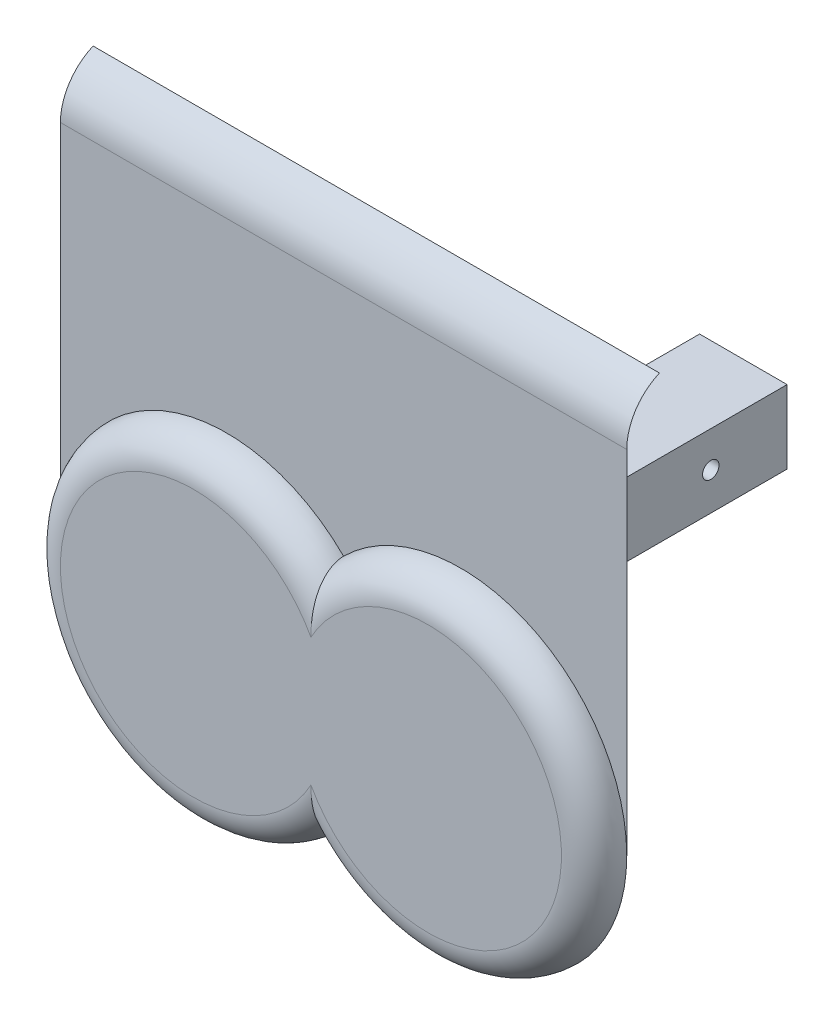
ISO-10303-21;
HEADER;
FILE_DESCRIPTION(('STEP AP214'),'2;1');
FILE_NAME('part.step','',(''),(''),'','','');
FILE_SCHEMA(('AUTOMOTIVE_DESIGN { 1 0 10303 214 1 1 1 1 }'));
ENDSEC;
DATA;
#1=APPLICATION_CONTEXT('core data for automotive mechanical design processes');
#2=APPLICATION_PROTOCOL_DEFINITION('international standard','automotive_design',2000,#1);
#3=PRODUCT_CONTEXT('',#1,'mechanical');
#4=PRODUCT('Part','Part','',(#3));
#5=PRODUCT_RELATED_PRODUCT_CATEGORY('part','',(#4));
#6=PRODUCT_DEFINITION_FORMATION('','',#4);
#7=PRODUCT_DEFINITION_CONTEXT('part definition',#1,'design');
#8=PRODUCT_DEFINITION('design','',#6,#7);
#9=PRODUCT_DEFINITION_SHAPE('','',#8);
#10=(LENGTH_UNIT() NAMED_UNIT(*) SI_UNIT(.MILLI.,.METRE.));
#11=(NAMED_UNIT(*) PLANE_ANGLE_UNIT() SI_UNIT($,.RADIAN.));
#12=(NAMED_UNIT(*) SI_UNIT($,.STERADIAN.) SOLID_ANGLE_UNIT());
#13=UNCERTAINTY_MEASURE_WITH_UNIT(LENGTH_MEASURE(1.E-05),#10,'distance_accuracy_value','');
#14=(GEOMETRIC_REPRESENTATION_CONTEXT(3) GLOBAL_UNCERTAINTY_ASSIGNED_CONTEXT((#13)) GLOBAL_UNIT_ASSIGNED_CONTEXT((#10,
#11,#12)) REPRESENTATION_CONTEXT('',''));
#15=CARTESIAN_POINT('',(0.,0.,0.));
#16=DIRECTION('',(0.,0.,1.));
#17=DIRECTION('',(1.,0.,0.));
#18=AXIS2_PLACEMENT_3D('',#15,#16,#17);
#19=CARTESIAN_POINT('',(25.7316100980738,12.2927245380799,-12.));
#20=DIRECTION('',(1.,0.,0.));
#21=DIRECTION('',(0.,0.,-1.));
#22=AXIS2_PLACEMENT_3D('',#19,#20,#21);
#23=PLANE('',#22);
#24=CARTESIAN_POINT('',(25.7316100980738,15.7320274793413,-4.98829969518511));
#25=DIRECTION('',(-1.,0.,0.));
#26=DIRECTION('',(0.,0.,1.));
#27=AXIS2_PLACEMENT_3D('',#24,#25,#26);
#28=CIRCLE('',#27,0.75565);
#29=CARTESIAN_POINT('',(25.7316100980738,15.7320274793413,-4.23264969518511));
#30=VERTEX_POINT('',#29);
#31=EDGE_CURVE('E122',#30,#30,#28,.T.);
#32=ORIENTED_EDGE('',*,*,#31,.T.);
#33=EDGE_LOOP('',(#32));
#34=FACE_BOUND('',#33,.T.);
#35=DIRECTION('',(0.,1.,0.));
#36=VECTOR('',#35,1.);
#37=CARTESIAN_POINT('',(25.7316100980738,12.2927245380799,3.));
#38=LINE('',#37,#36);
#39=CARTESIAN_POINT('',(25.7316100980738,12.2927245380799,3.));
#40=VERTEX_POINT('',#39);
#41=CARTESIAN_POINT('',(25.7316100980738,19.0162302948823,3.));
#42=VERTEX_POINT('',#41);
#43=EDGE_CURVE('E118',#40,#42,#38,.T.);
#44=ORIENTED_EDGE('',*,*,#43,.F.);
#45=DIRECTION('',(0.,0.,1.));
#46=VECTOR('',#45,1.);
#47=CARTESIAN_POINT('',(25.7316100980738,12.2927245380799,-12.));
#48=LINE('',#47,#46);
#49=CARTESIAN_POINT('',(25.7316100980738,12.2927245380799,-12.));
#50=VERTEX_POINT('',#49);
#51=EDGE_CURVE('E12',#50,#40,#48,.T.);
#52=ORIENTED_EDGE('',*,*,#51,.F.);
#53=DIRECTION('',(0.,1.,0.));
#54=VECTOR('',#53,1.);
#55=CARTESIAN_POINT('',(25.7316100980738,12.2927245380799,-12.));
#56=LINE('',#55,#54);
#57=CARTESIAN_POINT('',(25.7316100980738,19.0162302948823,-12.));
#58=VERTEX_POINT('',#57);
#59=EDGE_CURVE('E111',#50,#58,#56,.T.);
#60=ORIENTED_EDGE('',*,*,#59,.T.);
#61=DIRECTION('',(0.,0.,1.));
#62=VECTOR('',#61,1.);
#63=CARTESIAN_POINT('',(25.7316100980738,19.0162302948823,-12.));
#64=LINE('',#63,#62);
#65=EDGE_CURVE('E56',#58,#42,#64,.T.);
#66=ORIENTED_EDGE('',*,*,#65,.T.);
#67=EDGE_LOOP('',(#44,#52,#60,#66));
#68=FACE_BOUND('',#67,.T.);
#69=ADVANCED_FACE('F53',(#34,#68),#23,.T.);
#70=CARTESIAN_POINT('',(25.7316100980738,12.2927245380799,-12.));
#71=DIRECTION('',(0.,-1.,0.));
#72=DIRECTION('',(0.,0.,-1.));
#73=AXIS2_PLACEMENT_3D('',#70,#71,#72);
#74=PLANE('',#73);
#75=DIRECTION('',(1.,0.,0.));
#76=VECTOR('',#75,1.);
#77=CARTESIAN_POINT('',(25.7316100980738,12.2927245380799,3.));
#78=LINE('',#77,#76);
#79=CARTESIAN_POINT('',(17.692635823636,12.2927245380799,3.));
#80=VERTEX_POINT('',#79);
#81=EDGE_CURVE('E113',#80,#40,#78,.T.);
#82=ORIENTED_EDGE('',*,*,#81,.F.);
#83=DIRECTION('',(0.,0.,1.));
#84=VECTOR('',#83,1.);
#85=CARTESIAN_POINT('',(17.692635823636,12.2927245380799,-12.));
#86=LINE('',#85,#84);
#87=CARTESIAN_POINT('',(17.692635823636,12.2927245380799,-12.));
#88=VERTEX_POINT('',#87);
#89=EDGE_CURVE('E62',#88,#80,#86,.T.);
#90=ORIENTED_EDGE('',*,*,#89,.F.);
#91=DIRECTION('',(1.,0.,0.));
#92=VECTOR('',#91,1.);
#93=CARTESIAN_POINT('',(25.7316100980738,12.2927245380799,-12.));
#94=LINE('',#93,#92);
#95=EDGE_CURVE('E108',#88,#50,#94,.T.);
#96=ORIENTED_EDGE('',*,*,#95,.T.);
#97=ORIENTED_EDGE('',*,*,#51,.T.);
#98=EDGE_LOOP('',(#82,#90,#96,#97));
#99=FACE_BOUND('',#98,.T.);
#100=ADVANCED_FACE('F129',(#99),#74,.T.);
#101=CARTESIAN_POINT('',(17.692635823636,12.2927245380799,-12.));
#102=DIRECTION('',(-1.,0.,0.));
#103=DIRECTION('',(0.,0.,1.));
#104=AXIS2_PLACEMENT_3D('',#101,#102,#103);
#105=PLANE('',#104);
#106=CARTESIAN_POINT('',(17.692635823636,15.7320274793413,-4.98829969518511));
#107=DIRECTION('',(-1.,0.,0.));
#108=DIRECTION('',(0.,0.,1.));
#109=AXIS2_PLACEMENT_3D('',#106,#107,#108);
#110=CIRCLE('',#109,1.63195);
#111=CARTESIAN_POINT('',(17.692635823636,15.7320274793413,-3.35634969518511));
#112=VERTEX_POINT('',#111);
#113=EDGE_CURVE('E164',#112,#112,#110,.T.);
#114=ORIENTED_EDGE('',*,*,#113,.F.);
#115=EDGE_LOOP('',(#114));
#116=FACE_BOUND('',#115,.T.);
#117=DIRECTION('',(0.,-1.,0.));
#118=VECTOR('',#117,1.);
#119=CARTESIAN_POINT('',(17.692635823636,12.2927245380799,3.));
#120=LINE('',#119,#118);
#121=CARTESIAN_POINT('',(17.692635823636,19.0162302948823,3.));
#122=VERTEX_POINT('',#121);
#123=EDGE_CURVE('E103',#122,#80,#120,.T.);
#124=ORIENTED_EDGE('',*,*,#123,.F.);
#125=DIRECTION('',(0.,0.,1.));
#126=VECTOR('',#125,1.);
#127=CARTESIAN_POINT('',(17.692635823636,19.0162302948823,-12.));
#128=LINE('',#127,#126);
#129=CARTESIAN_POINT('',(17.692635823636,19.0162302948823,-12.));
#130=VERTEX_POINT('',#129);
#131=EDGE_CURVE('E98',#130,#122,#128,.T.);
#132=ORIENTED_EDGE('',*,*,#131,.F.);
#133=DIRECTION('',(0.,-1.,0.));
#134=VECTOR('',#133,1.);
#135=CARTESIAN_POINT('',(17.692635823636,12.2927245380799,-12.));
#136=LINE('',#135,#134);
#137=EDGE_CURVE('E101',#130,#88,#136,.T.);
#138=ORIENTED_EDGE('',*,*,#137,.T.);
#139=ORIENTED_EDGE('',*,*,#89,.T.);
#140=EDGE_LOOP('',(#124,#132,#138,#139));
#141=FACE_BOUND('',#140,.T.);
#142=ADVANCED_FACE('F100',(#116,#141),#105,.T.);
#143=CARTESIAN_POINT('',(25.7316100980738,19.0162302948823,-12.));
#144=DIRECTION('',(0.,1.,0.));
#145=DIRECTION('',(0.,0.,1.));
#146=AXIS2_PLACEMENT_3D('',#143,#144,#145);
#147=PLANE('',#146);
#148=DIRECTION('',(-1.,0.,0.));
#149=VECTOR('',#148,1.);
#150=CARTESIAN_POINT('',(25.7316100980738,19.0162302948823,3.));
#151=LINE('',#150,#149);
#152=EDGE_CURVE('E121',#42,#122,#151,.T.);
#153=ORIENTED_EDGE('',*,*,#152,.F.);
#154=ORIENTED_EDGE('',*,*,#65,.F.);
#155=DIRECTION('',(-1.,0.,0.));
#156=VECTOR('',#155,1.);
#157=CARTESIAN_POINT('',(25.7316100980738,19.0162302948823,-12.));
#158=LINE('',#157,#156);
#159=EDGE_CURVE('E107',#58,#130,#158,.T.);
#160=ORIENTED_EDGE('',*,*,#159,.T.);
#161=ORIENTED_EDGE('',*,*,#131,.T.);
#162=EDGE_LOOP('',(#153,#154,#160,#161));
#163=FACE_BOUND('',#162,.T.);
#164=ADVANCED_FACE('F110',(#163),#147,.T.);
#165=CARTESIAN_POINT('',(0.,0.,-12.));
#166=DIRECTION('',(0.,0.,1.));
#167=DIRECTION('',(1.,0.,0.));
#168=AXIS2_PLACEMENT_3D('',#165,#166,#167);
#169=PLANE('',#168);
#170=ORIENTED_EDGE('',*,*,#59,.F.);
#171=ORIENTED_EDGE('',*,*,#95,.F.);
#172=ORIENTED_EDGE('',*,*,#137,.F.);
#173=ORIENTED_EDGE('',*,*,#159,.F.);
#174=EDGE_LOOP('',(#170,#171,#172,#173));
#175=FACE_BOUND('',#174,.T.);
#176=ADVANCED_FACE('F106',(#175),#169,.F.);
#177=CARTESIAN_POINT('',(0.,0.,3.));
#178=DIRECTION('',(0.,0.,1.));
#179=DIRECTION('',(1.,0.,0.));
#180=AXIS2_PLACEMENT_3D('',#177,#178,#179);
#181=PLANE('',#180);
#182=ORIENTED_EDGE('',*,*,#43,.T.);
#183=ORIENTED_EDGE('',*,*,#152,.T.);
#184=ORIENTED_EDGE('',*,*,#123,.T.);
#185=ORIENTED_EDGE('',*,*,#81,.T.);
#186=EDGE_LOOP('',(#182,#183,#184,#185));
#187=FACE_BOUND('',#186,.T.);
#188=ADVANCED_FACE('F128',(#187),#181,.T.);
#189=CARTESIAN_POINT('',(17.692635823636,15.7320274793413,-4.98829969518511));
#190=DIRECTION('',(-1.,0.,0.));
#191=DIRECTION('',(0.,0.,1.));
#192=AXIS2_PLACEMENT_3D('',#189,#190,#191);
#193=CYLINDRICAL_SURFACE('',#192,0.75565);
#194=ORIENTED_EDGE('',*,*,#31,.F.);
#195=EDGE_LOOP('',(#194));
#196=FACE_BOUND('',#195,.T.);
#197=CARTESIAN_POINT('',(18.568935823636,15.7320274793413,-4.98829969518511));
#198=DIRECTION('',(-1.,0.,0.));
#199=DIRECTION('',(0.,0.,1.));
#200=AXIS2_PLACEMENT_3D('',#197,#198,#199);
#201=CIRCLE('',#200,0.75565);
#202=CARTESIAN_POINT('',(18.568935823636,15.7320274793413,-4.23264969518511));
#203=VERTEX_POINT('',#202);
#204=EDGE_CURVE('E161',#203,#203,#201,.T.);
#205=ORIENTED_EDGE('',*,*,#204,.T.);
#206=EDGE_LOOP('',(#205));
#207=FACE_BOUND('',#206,.T.);
#208=ADVANCED_FACE('F148',(#196,#207),#193,.F.);
#209=CARTESIAN_POINT('',(17.692635823636,15.7320274793413,-4.98829969518511));
#210=DIRECTION('',(-1.,0.,0.));
#211=DIRECTION('',(0.,0.,1.));
#212=AXIS2_PLACEMENT_3D('',#209,#210,#211);
#213=CONICAL_SURFACE('',#212,1.63195,0.785398163397448);
#214=ORIENTED_EDGE('',*,*,#204,.F.);
#215=EDGE_LOOP('',(#214));
#216=FACE_BOUND('',#215,.T.);
#217=ORIENTED_EDGE('',*,*,#113,.T.);
#218=EDGE_LOOP('',(#217));
#219=FACE_BOUND('',#218,.T.);
#220=ADVANCED_FACE('F152',(#216,#219),#213,.F.);
#221=CLOSED_SHELL('',(#69,#100,#142,#164,#176,#188,#208,#220));
#222=MANIFOLD_SOLID_BREP('B2',#221);
#223=CARTESIAN_POINT('',(0.,0.,3.));
#224=DIRECTION('',(0.,0.,-1.));
#225=DIRECTION('',(-1.,0.,0.));
#226=AXIS2_PLACEMENT_3D('',#223,#224,#225);
#227=PLANE('',#226);
#228=CARTESIAN_POINT('',(10.7519968942127,-10.8202864458883,3.));
#229=DIRECTION('',(0.,0.,1.));
#230=DIRECTION('',(1.,0.,0.));
#231=AXIS2_PLACEMENT_3D('',#228,#229,#230);
#232=CIRCLE('',#231,15.253984265897);
#233=CARTESIAN_POINT('',(26.0059811601098,-10.8202864458883,3.));
#234=VERTEX_POINT('',#233);
#235=CARTESIAN_POINT('',(0.,0.,3.));
#236=VERTEX_POINT('',#235);
#237=EDGE_CURVE('E281',#234,#236,#232,.T.);
#238=ORIENTED_EDGE('',*,*,#237,.F.);
#239=DIRECTION('',(0.,1.,0.));
#240=VECTOR('',#239,1.);
#241=CARTESIAN_POINT('',(26.0059811601098,-26.0742707117853,3.));
#242=LINE('',#241,#240);
#243=CARTESIAN_POINT('',(26.0059811601098,21.4916950168295,3.));
#244=VERTEX_POINT('',#243);
#245=EDGE_CURVE('E287',#234,#244,#242,.T.);
#246=ORIENTED_EDGE('',*,*,#245,.T.);
#247=DIRECTION('',(1.,0.,0.));
#248=VECTOR('',#247,1.);
#249=CARTESIAN_POINT('',(0.,21.4916950168295,3.));
#250=LINE('',#249,#248);
#251=CARTESIAN_POINT('',(-26.0059811601098,21.4916950168295,3.));
#252=VERTEX_POINT('',#251);
#253=EDGE_CURVE('E305',#244,#252,#250,.F.);
#254=ORIENTED_EDGE('',*,*,#253,.T.);
#255=DIRECTION('',(0.,-1.,0.));
#256=VECTOR('',#255,1.);
#257=CARTESIAN_POINT('',(-26.0059811601098,-26.0742707117853,3.));
#258=LINE('',#257,#256);
#259=CARTESIAN_POINT('',(-26.0059811601098,-10.8202864458883,3.));
#260=VERTEX_POINT('',#259);
#261=EDGE_CURVE('E292',#252,#260,#258,.T.);
#262=ORIENTED_EDGE('',*,*,#261,.T.);
#263=CARTESIAN_POINT('',(-10.7519968942127,-10.8202864458883,3.));
#264=DIRECTION('',(0.,0.,-1.));
#265=DIRECTION('',(-1.,0.,0.));
#266=AXIS2_PLACEMENT_3D('',#263,#264,#265);
#267=CIRCLE('',#266,15.253984265897);
#268=EDGE_CURVE('E297',#236,#260,#267,.F.);
#269=ORIENTED_EDGE('',*,*,#268,.F.);
#270=EDGE_LOOP('',(#238,#246,#254,#262,#269));
#271=FACE_BOUND('',#270,.T.);
#272=ADVANCED_FACE('F220',(#271),#227,.F.);
#273=CARTESIAN_POINT('',(-26.0059811601098,21.4916950168295,-2.));
#274=DIRECTION('',(1.,0.,0.));
#275=DIRECTION('',(0.,0.,-1.));
#276=AXIS2_PLACEMENT_3D('',#273,#274,#275);
#277=CYLINDRICAL_SURFACE('',#276,5.);
#278=CARTESIAN_POINT('',(26.0059811601098,21.4916950168295,-2.));
#279=DIRECTION('',(-1.,0.,0.));
#280=DIRECTION('',(0.,0.,1.));
#281=AXIS2_PLACEMENT_3D('',#278,#279,#280);
#282=CIRCLE('',#281,5.);
#283=CARTESIAN_POINT('',(26.0059811601098,26.0742707117853,0.));
#284=VERTEX_POINT('',#283);
#285=EDGE_CURVE('E313',#284,#244,#282,.F.);
#286=ORIENTED_EDGE('',*,*,#285,.F.);
#287=DIRECTION('',(-1.,0.,0.));
#288=VECTOR('',#287,1.);
#289=CARTESIAN_POINT('',(-26.0059811601098,26.0742707117853,0.));
#290=LINE('',#289,#288);
#291=CARTESIAN_POINT('',(-26.0059811601098,26.0742707117853,0.));
#292=VERTEX_POINT('',#291);
#293=EDGE_CURVE('E293',#284,#292,#290,.T.);
#294=ORIENTED_EDGE('',*,*,#293,.T.);
#295=CARTESIAN_POINT('',(-26.0059811601098,21.4916950168295,-2.));
#296=DIRECTION('',(1.,0.,0.));
#297=DIRECTION('',(0.,0.,-1.));
#298=AXIS2_PLACEMENT_3D('',#295,#296,#297);
#299=CIRCLE('',#298,5.);
#300=EDGE_CURVE('E310',#252,#292,#299,.F.);
#301=ORIENTED_EDGE('',*,*,#300,.F.);
#302=ORIENTED_EDGE('',*,*,#253,.F.);
#303=EDGE_LOOP('',(#286,#294,#301,#302));
#304=FACE_BOUND('',#303,.T.);
#305=ADVANCED_FACE('F327',(#304),#277,.T.);
#306=CARTESIAN_POINT('',(-10.7519968942127,-10.8202864458883,6.));
#307=DIRECTION('',(0.,0.,1.));
#308=DIRECTION('',(1.,0.,0.));
#309=AXIS2_PLACEMENT_3D('',#306,#307,#308);
#310=PLANE('',#309);
#311=CARTESIAN_POINT('',(10.7519968942127,-10.8202864458883,6.));
#312=DIRECTION('',(0.,0.,1.));
#313=DIRECTION('',(1.,0.,0.));
#314=AXIS2_PLACEMENT_3D('',#311,#312,#313);
#315=CIRCLE('',#314,12.253984265897);
#316=CARTESIAN_POINT('',(0.,-16.6986104566665,6.));
#317=VERTEX_POINT('',#316);
#318=CARTESIAN_POINT('',(0.,-4.94196243511008,6.));
#319=VERTEX_POINT('',#318);
#320=EDGE_CURVE('E232',#317,#319,#315,.T.);
#321=ORIENTED_EDGE('',*,*,#320,.T.);
#322=CARTESIAN_POINT('',(-10.7519968942127,-10.8202864458883,6.));
#323=DIRECTION('',(0.,0.,1.));
#324=DIRECTION('',(1.,0.,0.));
#325=AXIS2_PLACEMENT_3D('',#322,#323,#324);
#326=CIRCLE('',#325,12.253984265897);
#327=EDGE_CURVE('E51',#319,#317,#326,.T.);
#328=ORIENTED_EDGE('',*,*,#327,.T.);
#329=EDGE_LOOP('',(#321,#328));
#330=FACE_BOUND('',#329,.T.);
#331=ADVANCED_FACE('F326',(#330),#310,.T.);
#332=CARTESIAN_POINT('',(10.7519968942127,-10.8202864458883,3.));
#333=DIRECTION('',(0.,0.,1.));
#334=DIRECTION('',(1.,0.,0.));
#335=AXIS2_PLACEMENT_3D('',#332,#333,#334);
#336=TOROIDAL_SURFACE('',#335,12.253984265897,3.);
#337=CARTESIAN_POINT('',(10.7519968942127,-26.0742707117853,3.));
#338=VERTEX_POINT('',#337);
#339=EDGE_CURVE('E277',#338,#234,#232,.T.);
#340=ORIENTED_EDGE('',*,*,#339,.T.);
#341=ORIENTED_EDGE('',*,*,#237,.T.);
#342=CARTESIAN_POINT('',(0.,0.,3.));
#343=CARTESIAN_POINT('',(0.,1.95007124230978E-05,3.06620735825665));
#344=CARTESIAN_POINT('',(0.,-0.00308914103174876,3.13240448509653));
#345=CARTESIAN_POINT('',(0.,-0.0154129297342623,3.26418834229766));
#346=CARTESIAN_POINT('',(0.,-0.0246243300564617,3.32977542214596));
#347=CARTESIAN_POINT('',(0.,-0.0489150876336411,3.45935647856996));
#348=CARTESIAN_POINT('',(0.,-0.0639510595788129,3.52335859583567));
#349=CARTESIAN_POINT('',(0.,-0.0996126550086658,3.6497722822654));
#350=CARTESIAN_POINT('',(0.,-0.120238854391052,3.71218368683121));
#351=CARTESIAN_POINT('',(0.,-0.189925072554892,3.89611380867449));
#352=CARTESIAN_POINT('',(0.,-0.246870340615428,4.01472802776266));
#353=CARTESIAN_POINT('',(0.,-0.378590412950921,4.24164431273649));
#354=CARTESIAN_POINT('',(0.,-0.453397738438844,4.34992705900544));
#355=CARTESIAN_POINT('',(0.,-0.646457060848609,4.59108534031693));
#356=CARTESIAN_POINT('',(0.,-0.770723813663914,4.71915163237239));
#357=CARTESIAN_POINT('',(0.,-1.03821549691492,4.95349557967945));
#358=CARTESIAN_POINT('',(0.,-1.1814718480384,5.05973636242014));
#359=CARTESIAN_POINT('',(0.,-1.54794279573178,5.29442328762124));
#360=CARTESIAN_POINT('',(0.,-1.7783367869301,5.4116612752752));
#361=CARTESIAN_POINT('',(0.,-2.13501488137236,5.55956644266099));
#362=CARTESIAN_POINT('',(0.,-2.25592963318741,5.60425171601462));
#363=CARTESIAN_POINT('',(0.,-2.50057040122472,5.68514582861091));
#364=CARTESIAN_POINT('',(0.,-2.62429584170236,5.72135638695055));
#365=CARTESIAN_POINT('',(0.,-2.926553499039,5.79980206606993));
#366=CARTESIAN_POINT('',(0.,-3.10610361148385,5.83809299124814));
#367=CARTESIAN_POINT('',(0.,-3.46753275263463,5.90129757462734));
#368=CARTESIAN_POINT('',(0.,-3.64941278674765,5.92620524394804));
#369=CARTESIAN_POINT('',(0.,-4.1964853468487,5.9838675710475));
#370=CARTESIAN_POINT('',(0.,-4.56352844716225,5.99965888699919));
#371=CARTESIAN_POINT('',(0.,-4.93400291728388,5.99999816902383));
#372=CARTESIAN_POINT('',(0.,-4.93798271046903,5.99999999120789));
#373=CARTESIAN_POINT('',(0.,-4.94196243511008,6.));
#374=B_SPLINE_CURVE_WITH_KNOTS('',3,(#342,#343,#344,#345,#346,#347,#348,#349,#350,#351,#352,
#353,#354,#355,#356,#357,#358,#359,#360,#361,#362,#363,#364,#365,#366,#367,#368,#369,#370,#371,
#372,#373),.UNSPECIFIED.,.F.,.F.,(4,2,2,2,2,2,2,2,2,2,2,2,2,2,2,4),(0.,0.198532368615019,
0.396942966046739,0.593903237432136,0.790883807117218,1.18364017627619,1.57711715889877,
2.10947248890786,2.64271992713783,3.41363951865964,3.80016544805583,4.18661290253029,
4.73673892687725,5.28711092282157,6.38657665083775,6.39851602778433),.UNSPECIFIED.);
#375=EDGE_CURVE('E224',#319,#236,#374,.F.);
#376=ORIENTED_EDGE('',*,*,#375,.F.);
#377=ORIENTED_EDGE('',*,*,#320,.F.);
#378=CARTESIAN_POINT('',(0.,-21.6405728917765,3.));
#379=CARTESIAN_POINT('',(0.,-21.640592392489,3.06620735825665));
#380=CARTESIAN_POINT('',(0.,-21.6374837507448,3.13240448509653));
#381=CARTESIAN_POINT('',(0.,-21.6251599620423,3.26418834229766));
#382=CARTESIAN_POINT('',(0.,-21.6159485617201,3.32977542214596));
#383=CARTESIAN_POINT('',(0.,-21.5916578041429,3.45935647856996));
#384=CARTESIAN_POINT('',(0.,-21.5766218321977,3.52335859583566));
#385=CARTESIAN_POINT('',(0.,-21.5409602367679,3.64977228226539));
#386=CARTESIAN_POINT('',(0.,-21.5203340373855,3.71218368683121));
#387=CARTESIAN_POINT('',(0.,-21.4506478192216,3.89611380867449));
#388=CARTESIAN_POINT('',(0.,-21.3937025511611,4.01472802776266));
#389=CARTESIAN_POINT('',(0.,-21.2619824788256,4.24164431273649));
#390=CARTESIAN_POINT('',(0.,-21.1871751533377,4.34992705900544));
#391=CARTESIAN_POINT('',(0.,-20.9941158309279,4.59108534031693));
#392=CARTESIAN_POINT('',(0.,-20.8698490781126,4.71915163237239));
#393=CARTESIAN_POINT('',(0.,-20.6023573948616,4.95349557967945));
#394=CARTESIAN_POINT('',(0.,-20.4591010437381,5.05973636242014));
#395=CARTESIAN_POINT('',(0.,-20.0926300960448,5.29442328762124));
#396=CARTESIAN_POINT('',(0.,-19.8622361048464,5.4116612752752));
#397=CARTESIAN_POINT('',(0.,-19.5055580104042,5.55956644266099));
#398=CARTESIAN_POINT('',(0.,-19.3846432585891,5.60425171601462));
#399=CARTESIAN_POINT('',(0.,-19.1400024905518,5.68514582861091));
#400=CARTESIAN_POINT('',(0.,-19.0162770500742,5.72135638695055));
#401=CARTESIAN_POINT('',(0.,-18.7140193927375,5.79980206606994));
#402=CARTESIAN_POINT('',(0.,-18.5344692802927,5.83809299124814));
#403=CARTESIAN_POINT('',(0.,-18.1730401391419,5.90129757462734));
#404=CARTESIAN_POINT('',(0.,-17.9911601050289,5.92620524394804));
#405=CARTESIAN_POINT('',(0.,-17.4440875449278,5.9838675710475));
#406=CARTESIAN_POINT('',(0.,-17.0770444446143,5.99965888699919));
#407=CARTESIAN_POINT('',(0.,-16.7065699744927,5.99999816902383));
#408=CARTESIAN_POINT('',(0.,-16.7025901813075,5.99999999120789));
#409=CARTESIAN_POINT('',(0.,-16.6986104566665,6.));
#410=B_SPLINE_CURVE_WITH_KNOTS('',3,(#378,#379,#380,#381,#382,#383,#384,#385,#386,#387,#388,
#389,#390,#391,#392,#393,#394,#395,#396,#397,#398,#399,#400,#401,#402,#403,#404,#405,#406,#407,
#408,#409),.UNSPECIFIED.,.F.,.F.,(4,2,2,2,2,2,2,2,2,2,2,2,2,2,2,4),(0.,0.198532368615019,
0.396942966046738,0.593903237432135,0.790883807117218,1.18364017627619,1.57711715889877,
2.10947248890786,2.64271992713783,3.41363951865964,3.80016544805583,4.18661290253029,
4.73673892687725,5.28711092282156,6.38657665083775,6.39851602778433),.UNSPECIFIED.);
#411=CARTESIAN_POINT('',(0.,-21.6405728917765,3.));
#412=VERTEX_POINT('',#411);
#413=EDGE_CURVE('E245',#412,#317,#410,.T.);
#414=ORIENTED_EDGE('',*,*,#413,.F.);
#415=EDGE_CURVE('E284',#412,#338,#232,.T.);
#416=ORIENTED_EDGE('',*,*,#415,.T.);
#417=EDGE_LOOP('',(#340,#341,#376,#377,#414,#416));
#418=FACE_BOUND('',#417,.T.);
#419=ADVANCED_FACE('F279',(#418),#336,.T.);
#420=CARTESIAN_POINT('',(-10.7519968942127,-10.8202864458883,3.));
#421=DIRECTION('',(0.,0.,1.));
#422=DIRECTION('',(1.,0.,0.));
#423=AXIS2_PLACEMENT_3D('',#420,#421,#422);
#424=TOROIDAL_SURFACE('',#423,12.253984265897,3.);
#425=CARTESIAN_POINT('',(-10.7519968942127,-10.8202864458883,3.));
#426=DIRECTION('',(0.,0.,1.));
#427=DIRECTION('',(1.,0.,0.));
#428=AXIS2_PLACEMENT_3D('',#425,#426,#427);
#429=CIRCLE('',#428,15.253984265897);
#430=CARTESIAN_POINT('',(-10.7519968942127,-26.0742707117853,3.));
#431=VERTEX_POINT('',#430);
#432=EDGE_CURVE('E298',#260,#431,#429,.T.);
#433=ORIENTED_EDGE('',*,*,#432,.T.);
#434=EDGE_CURVE('E316',#431,#412,#267,.F.);
#435=ORIENTED_EDGE('',*,*,#434,.T.);
#436=ORIENTED_EDGE('',*,*,#413,.T.);
#437=ORIENTED_EDGE('',*,*,#327,.F.);
#438=ORIENTED_EDGE('',*,*,#375,.T.);
#439=ORIENTED_EDGE('',*,*,#268,.T.);
#440=EDGE_LOOP('',(#433,#435,#436,#437,#438,#439));
#441=FACE_BOUND('',#440,.T.);
#442=ADVANCED_FACE('F221',(#441),#424,.T.);
#443=OPEN_SHELL('',(#272,#305,#331,#419,#442));
#444=SHELL_BASED_SURFACE_MODEL('B6',(#443));
#445=ADVANCED_BREP_SHAPE_REPRESENTATION('',(#18,#222),#14);
#446=MANIFOLD_SURFACE_SHAPE_REPRESENTATION('',(#18,#444),#14);
#447=SHAPE_REPRESENTATION('',(#18),#14);
#448=SHAPE_DEFINITION_REPRESENTATION(#9,#447);
#449=SHAPE_REPRESENTATION_RELATIONSHIP('','',#447,#445);
#450=SHAPE_REPRESENTATION_RELATIONSHIP('','',#447,#446);
ENDSEC;
END-ISO-10303-21;
